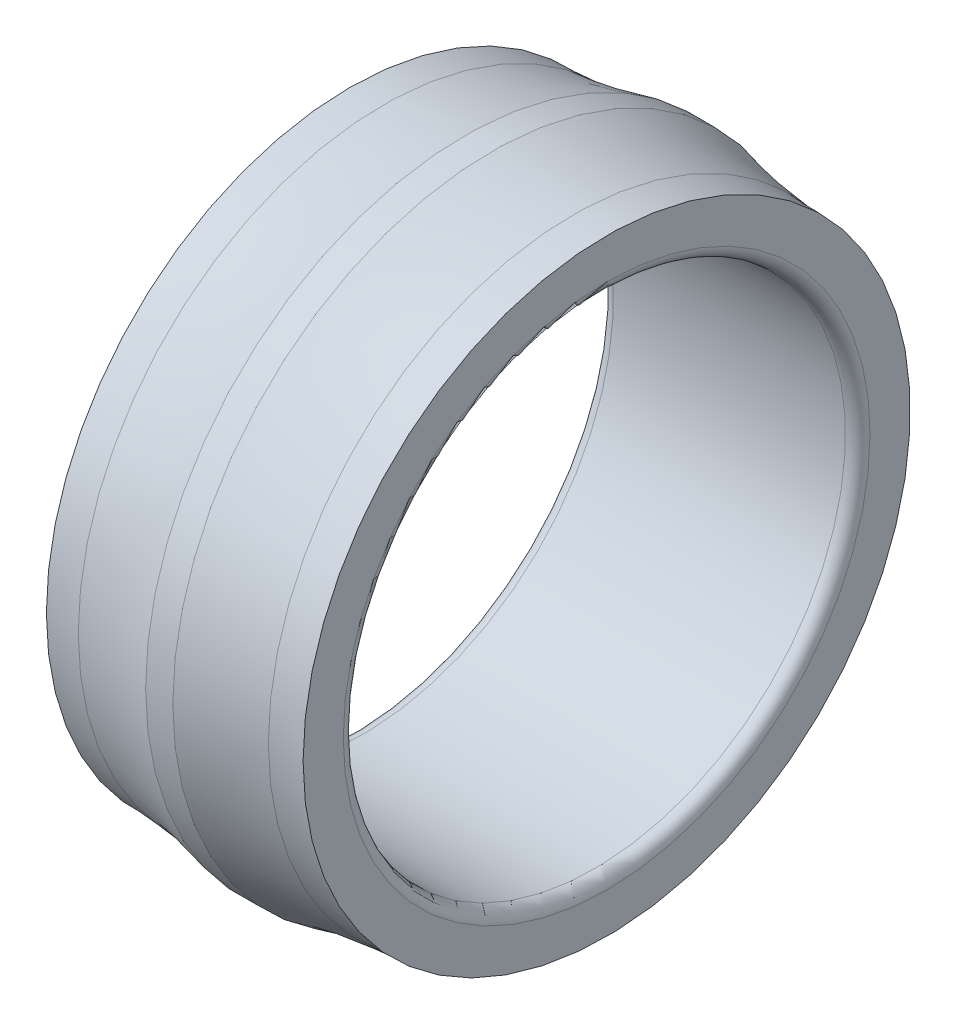
ISO-10303-21;
HEADER;
FILE_DESCRIPTION(('STEP AP214'),'2;1');
FILE_NAME('part.step','',(''),(''),'','','');
FILE_SCHEMA(('AUTOMOTIVE_DESIGN { 1 0 10303 214 1 1 1 1 }'));
ENDSEC;
DATA;
#1=APPLICATION_CONTEXT('core data for automotive mechanical design processes');
#2=APPLICATION_PROTOCOL_DEFINITION('international standard','automotive_design',2000,#1);
#3=PRODUCT_CONTEXT('',#1,'mechanical');
#4=PRODUCT('Part','Part','',(#3));
#5=PRODUCT_RELATED_PRODUCT_CATEGORY('part','',(#4));
#6=PRODUCT_DEFINITION_FORMATION('','',#4);
#7=PRODUCT_DEFINITION_CONTEXT('part definition',#1,'design');
#8=PRODUCT_DEFINITION('design','',#6,#7);
#9=PRODUCT_DEFINITION_SHAPE('','',#8);
#10=(LENGTH_UNIT() NAMED_UNIT(*) SI_UNIT(.MILLI.,.METRE.));
#11=(NAMED_UNIT(*) PLANE_ANGLE_UNIT() SI_UNIT($,.RADIAN.));
#12=(NAMED_UNIT(*) SI_UNIT($,.STERADIAN.) SOLID_ANGLE_UNIT());
#13=UNCERTAINTY_MEASURE_WITH_UNIT(LENGTH_MEASURE(1.E-05),#10,'distance_accuracy_value','');
#14=(GEOMETRIC_REPRESENTATION_CONTEXT(3) GLOBAL_UNCERTAINTY_ASSIGNED_CONTEXT((#13)) GLOBAL_UNIT_ASSIGNED_CONTEXT((#10,
#11,#12)) REPRESENTATION_CONTEXT('',''));
#15=CARTESIAN_POINT('',(0.,0.,0.));
#16=DIRECTION('',(0.,0.,1.));
#17=DIRECTION('',(1.,0.,0.));
#18=AXIS2_PLACEMENT_3D('',#15,#16,#17);
#19=CARTESIAN_POINT('',(0.,-27.7052765498038,-27.2));
#20=DIRECTION('',(-1.,0.,0.));
#21=DIRECTION('',(0.,0.,1.));
#22=AXIS2_PLACEMENT_3D('',#19,#20,#21);
#23=PLANE('',#22);
#24=CARTESIAN_POINT('',(0.,0.,0.));
#25=DIRECTION('',(-1.,0.,0.));
#26=DIRECTION('',(0.,0.,-1.));
#27=AXIS2_PLACEMENT_3D('',#24,#25,#26);
#28=CIRCLE('',#27,27.2);
#29=CARTESIAN_POINT('',(0.,0.,-27.2));
#30=VERTEX_POINT('',#29);
#31=EDGE_CURVE('E50',#30,#30,#28,.F.);
#32=ORIENTED_EDGE('',*,*,#31,.F.);
#33=EDGE_LOOP('',(#32));
#34=FACE_BOUND('',#33,.T.);
#35=CARTESIAN_POINT('',(0.,0.,0.));
#36=DIRECTION('',(1.,0.,0.));
#37=DIRECTION('',(0.,0.,1.));
#38=AXIS2_PLACEMENT_3D('',#35,#36,#37);
#39=CIRCLE('',#38,23.6000001099564);
#40=CARTESIAN_POINT('',(0.,0.,23.6000001099564));
#41=VERTEX_POINT('',#40);
#42=EDGE_CURVE('E47',#41,#41,#39,.T.);
#43=ORIENTED_EDGE('',*,*,#42,.T.);
#44=EDGE_LOOP('',(#43));
#45=FACE_BOUND('',#44,.T.);
#46=ADVANCED_FACE('F15',(#34,#45),#23,.T.);
#47=CARTESIAN_POINT('',(23.,-27.7052765498038,27.2));
#48=DIRECTION('',(1.,0.,0.));
#49=DIRECTION('',(0.,0.,-1.));
#50=AXIS2_PLACEMENT_3D('',#47,#48,#49);
#51=PLANE('',#50);
#52=CARTESIAN_POINT('',(23.,0.,0.));
#53=DIRECTION('',(1.,0.,0.));
#54=DIRECTION('',(0.,0.,1.));
#55=AXIS2_PLACEMENT_3D('',#52,#53,#54);
#56=CIRCLE('',#55,27.2);
#57=CARTESIAN_POINT('',(23.,0.,27.2));
#58=VERTEX_POINT('',#57);
#59=EDGE_CURVE('E44',#58,#58,#56,.T.);
#60=ORIENTED_EDGE('',*,*,#59,.T.);
#61=EDGE_LOOP('',(#60));
#62=FACE_BOUND('',#61,.T.);
#63=CARTESIAN_POINT('',(23.,0.,0.));
#64=DIRECTION('',(-1.,0.,0.));
#65=DIRECTION('',(0.,0.,-1.));
#66=AXIS2_PLACEMENT_3D('',#63,#64,#65);
#67=CIRCLE('',#66,23.6);
#68=CARTESIAN_POINT('',(23.,0.,-23.6));
#69=VERTEX_POINT('',#68);
#70=EDGE_CURVE('E41',#69,#69,#67,.F.);
#71=ORIENTED_EDGE('',*,*,#70,.F.);
#72=EDGE_LOOP('',(#71));
#73=FACE_BOUND('',#72,.T.);
#74=ADVANCED_FACE('F57',(#62,#73),#51,.T.);
#75=CARTESIAN_POINT('',(1.10000000000035,0.,0.));
#76=DIRECTION('',(1.,0.,0.));
#77=DIRECTION('',(0.,0.,1.));
#78=AXIS2_PLACEMENT_3D('',#75,#76,#77);
#79=TOROIDAL_SURFACE('',#78,23.6000000000003,1.10000000000035);
#80=CARTESIAN_POINT('',(1.1,0.,0.));
#81=DIRECTION('',(1.,0.,0.));
#82=DIRECTION('',(0.,0.,1.));
#83=AXIS2_PLACEMENT_3D('',#80,#81,#82);
#84=CIRCLE('',#83,22.5);
#85=CARTESIAN_POINT('',(1.1,0.,22.5));
#86=VERTEX_POINT('',#85);
#87=EDGE_CURVE('E38',#86,#86,#84,.T.);
#88=ORIENTED_EDGE('',*,*,#87,.T.);
#89=EDGE_LOOP('',(#88));
#90=FACE_BOUND('',#89,.T.);
#91=ORIENTED_EDGE('',*,*,#42,.F.);
#92=EDGE_LOOP('',(#91));
#93=FACE_BOUND('',#92,.T.);
#94=ADVANCED_FACE('F61',(#90,#93),#79,.T.);
#95=CARTESIAN_POINT('',(23.,0.,0.));
#96=DIRECTION('',(1.,0.,0.));
#97=DIRECTION('',(0.,0.,1.));
#98=AXIS2_PLACEMENT_3D('',#95,#96,#97);
#99=CYLINDRICAL_SURFACE('',#98,22.5);
#100=CARTESIAN_POINT('',(21.9,0.,0.));
#101=DIRECTION('',(1.,0.,0.));
#102=DIRECTION('',(0.,0.,1.));
#103=AXIS2_PLACEMENT_3D('',#100,#101,#102);
#104=CIRCLE('',#103,22.5);
#105=CARTESIAN_POINT('',(21.9,0.,22.5));
#106=VERTEX_POINT('',#105);
#107=EDGE_CURVE('E35',#106,#106,#104,.T.);
#108=ORIENTED_EDGE('',*,*,#107,.T.);
#109=EDGE_LOOP('',(#108));
#110=FACE_BOUND('',#109,.T.);
#111=ORIENTED_EDGE('',*,*,#87,.F.);
#112=EDGE_LOOP('',(#111));
#113=FACE_BOUND('',#112,.T.);
#114=ADVANCED_FACE('F63',(#110,#113),#99,.F.);
#115=CARTESIAN_POINT('',(21.8999999999993,0.,0.));
#116=DIRECTION('',(1.,0.,0.));
#117=DIRECTION('',(0.,0.,1.));
#118=AXIS2_PLACEMENT_3D('',#115,#116,#117);
#119=TOROIDAL_SURFACE('',#118,23.6000000000007,1.10000000000069);
#120=ORIENTED_EDGE('',*,*,#70,.T.);
#121=EDGE_LOOP('',(#120));
#122=FACE_BOUND('',#121,.T.);
#123=ORIENTED_EDGE('',*,*,#107,.F.);
#124=EDGE_LOOP('',(#123));
#125=FACE_BOUND('',#124,.T.);
#126=ADVANCED_FACE('F71',(#122,#125),#119,.T.);
#127=CARTESIAN_POINT('',(22.5026146322556,0.,0.));
#128=DIRECTION('',(1.,0.,0.));
#129=DIRECTION('',(0.,0.,1.));
#130=AXIS2_PLACEMENT_3D('',#127,#128,#129);
#131=TOROIDAL_SURFACE('',#130,50.1946212794681,22.9999999997872);
#132=ORIENTED_EDGE('',*,*,#59,.F.);
#133=EDGE_LOOP('',(#132));
#134=FACE_BOUND('',#133,.T.);
#135=CARTESIAN_POINT('',(20.015500206275,0.,0.));
#136=DIRECTION('',(1.,0.,0.));
#137=DIRECTION('',(0.,0.,1.));
#138=AXIS2_PLACEMENT_3D('',#135,#136,#137);
#139=CIRCLE('',#138,27.3294892697401);
#140=CARTESIAN_POINT('',(20.015500206275,0.,27.3294892697401));
#141=VERTEX_POINT('',#140);
#142=EDGE_CURVE('E30',#141,#141,#139,.T.);
#143=ORIENTED_EDGE('',*,*,#142,.T.);
#144=EDGE_LOOP('',(#143));
#145=FACE_BOUND('',#144,.T.);
#146=ADVANCED_FACE('F79',(#134,#145),#131,.F.);
#147=CARTESIAN_POINT('',(22.8955466623051,0.,0.));
#148=DIRECTION('',(1.,0.,0.));
#149=DIRECTION('',(0.,0.,1.));
#150=AXIS2_PLACEMENT_3D('',#147,#148,#149);
#151=TOROIDAL_SURFACE('',#150,65.6283532399279,38.406999999946);
#152=CARTESIAN_POINT('',(12.718247013537,0.,0.));
#153=DIRECTION('',(1.,0.,0.));
#154=DIRECTION('',(0.,0.,1.));
#155=AXIS2_PLACEMENT_3D('',#152,#153,#154);
#156=CIRCLE('',#155,28.594311861015);
#157=CARTESIAN_POINT('',(12.718247013537,0.,28.594311861015));
#158=VERTEX_POINT('',#157);
#159=EDGE_CURVE('E26',#158,#158,#156,.T.);
#160=ORIENTED_EDGE('',*,*,#159,.T.);
#161=EDGE_LOOP('',(#160));
#162=FACE_BOUND('',#161,.T.);
#163=ORIENTED_EDGE('',*,*,#142,.F.);
#164=EDGE_LOOP('',(#163));
#165=FACE_BOUND('',#164,.T.);
#166=ADVANCED_FACE('F83',(#162,#165),#151,.F.);
#167=CARTESIAN_POINT('',(23.,0.,0.));
#168=DIRECTION('',(1.,0.,0.));
#169=DIRECTION('',(0.,0.,1.));
#170=AXIS2_PLACEMENT_3D('',#167,#168,#169);
#171=CYLINDRICAL_SURFACE('',#170,28.594311861015);
#172=CARTESIAN_POINT('',(10.281752986463,0.,0.));
#173=DIRECTION('',(1.,0.,0.));
#174=DIRECTION('',(0.,0.,1.));
#175=AXIS2_PLACEMENT_3D('',#172,#173,#174);
#176=CIRCLE('',#175,28.594311861015);
#177=CARTESIAN_POINT('',(10.281752986463,0.,28.594311861015));
#178=VERTEX_POINT('',#177);
#179=EDGE_CURVE('E22',#178,#178,#176,.T.);
#180=ORIENTED_EDGE('',*,*,#179,.T.);
#181=EDGE_LOOP('',(#180));
#182=FACE_BOUND('',#181,.T.);
#183=ORIENTED_EDGE('',*,*,#159,.F.);
#184=EDGE_LOOP('',(#183));
#185=FACE_BOUND('',#184,.T.);
#186=ADVANCED_FACE('F87',(#182,#185),#171,.T.);
#187=CARTESIAN_POINT('',(0.104453337693695,0.,0.));
#188=DIRECTION('',(1.,0.,0.));
#189=DIRECTION('',(0.,0.,1.));
#190=AXIS2_PLACEMENT_3D('',#187,#188,#189);
#191=TOROIDAL_SURFACE('',#190,65.6283532399357,38.4069999999537);
#192=CARTESIAN_POINT('',(2.98449979372456,0.,0.));
#193=DIRECTION('',(1.,0.,0.));
#194=DIRECTION('',(0.,0.,1.));
#195=AXIS2_PLACEMENT_3D('',#192,#193,#194);
#196=CIRCLE('',#195,27.32948926974);
#197=CARTESIAN_POINT('',(2.98449979372456,0.,27.32948926974));
#198=VERTEX_POINT('',#197);
#199=EDGE_CURVE('E10',#198,#198,#196,.T.);
#200=ORIENTED_EDGE('',*,*,#199,.T.);
#201=EDGE_LOOP('',(#200));
#202=FACE_BOUND('',#201,.T.);
#203=ORIENTED_EDGE('',*,*,#179,.F.);
#204=EDGE_LOOP('',(#203));
#205=FACE_BOUND('',#204,.T.);
#206=ADVANCED_FACE('F90',(#202,#205),#191,.F.);
#207=CARTESIAN_POINT('',(0.49738536774439,0.,0.));
#208=DIRECTION('',(1.,0.,0.));
#209=DIRECTION('',(0.,0.,1.));
#210=AXIS2_PLACEMENT_3D('',#207,#208,#209);
#211=TOROIDAL_SURFACE('',#210,50.1946212794598,22.999999999779);
#212=ORIENTED_EDGE('',*,*,#199,.F.);
#213=EDGE_LOOP('',(#212));
#214=FACE_BOUND('',#213,.T.);
#215=ORIENTED_EDGE('',*,*,#31,.T.);
#216=EDGE_LOOP('',(#215));
#217=FACE_BOUND('',#216,.T.);
#218=ADVANCED_FACE('F17',(#214,#217),#211,.F.);
#219=CLOSED_SHELL('',(#46,#74,#94,#114,#126,#146,#166,#186,#206,#218));
#220=MANIFOLD_SOLID_BREP('B1',#219);
#221=ADVANCED_BREP_SHAPE_REPRESENTATION('',(#18,#220),#14);
#222=SHAPE_DEFINITION_REPRESENTATION(#9,#221);
ENDSEC;
END-ISO-10303-21;
